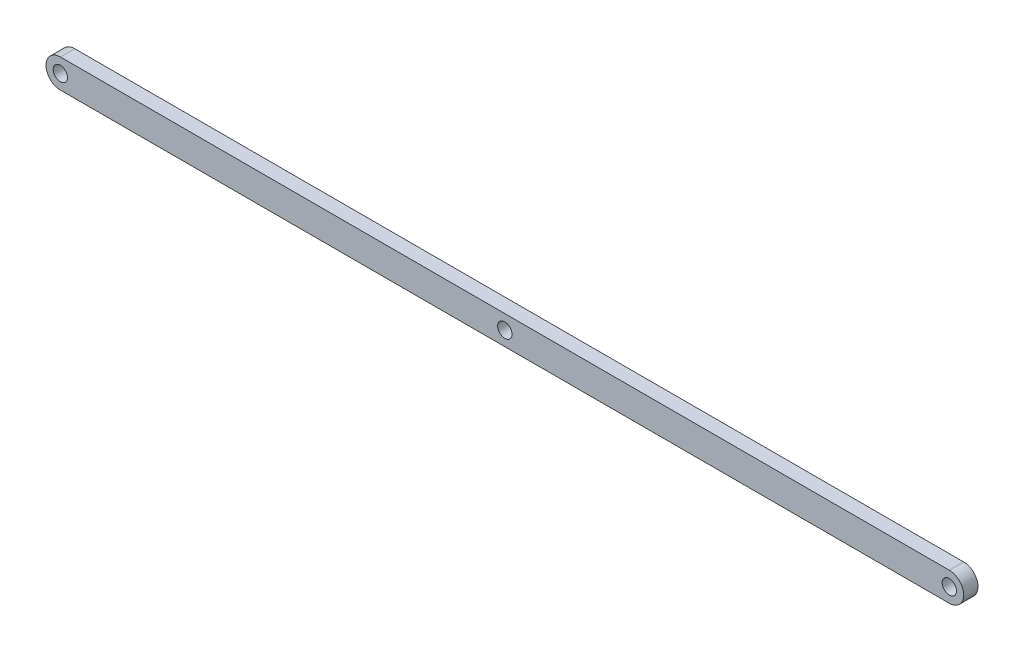
ISO-10303-21;
HEADER;
FILE_DESCRIPTION(('STEP AP214'),'2;1');
FILE_NAME('part.step','',(''),(''),'','','');
FILE_SCHEMA(('AUTOMOTIVE_DESIGN { 1 0 10303 214 1 1 1 1 }'));
ENDSEC;
DATA;
#1=APPLICATION_CONTEXT('core data for automotive mechanical design processes');
#2=APPLICATION_PROTOCOL_DEFINITION('international standard','automotive_design',2000,#1);
#3=PRODUCT_CONTEXT('',#1,'mechanical');
#4=PRODUCT('Part','Part','',(#3));
#5=PRODUCT_RELATED_PRODUCT_CATEGORY('part','',(#4));
#6=PRODUCT_DEFINITION_FORMATION('','',#4);
#7=PRODUCT_DEFINITION_CONTEXT('part definition',#1,'design');
#8=PRODUCT_DEFINITION('design','',#6,#7);
#9=PRODUCT_DEFINITION_SHAPE('','',#8);
#10=(LENGTH_UNIT() NAMED_UNIT(*) SI_UNIT(.MILLI.,.METRE.));
#11=(NAMED_UNIT(*) PLANE_ANGLE_UNIT() SI_UNIT($,.RADIAN.));
#12=(NAMED_UNIT(*) SI_UNIT($,.STERADIAN.) SOLID_ANGLE_UNIT());
#13=UNCERTAINTY_MEASURE_WITH_UNIT(LENGTH_MEASURE(1.E-05),#10,'distance_accuracy_value','');
#14=(GEOMETRIC_REPRESENTATION_CONTEXT(3) GLOBAL_UNCERTAINTY_ASSIGNED_CONTEXT((#13)) GLOBAL_UNIT_ASSIGNED_CONTEXT((#10,
#11,#12)) REPRESENTATION_CONTEXT('',''));
#15=CARTESIAN_POINT('',(0.,0.,0.));
#16=DIRECTION('',(0.,0.,1.));
#17=DIRECTION('',(1.,0.,0.));
#18=AXIS2_PLACEMENT_3D('',#15,#16,#17);
#19=CARTESIAN_POINT('',(310.,1.44510668817275E-13,10.));
#20=DIRECTION('',(0.,0.,1.));
#21=DIRECTION('',(1.,0.,0.));
#22=AXIS2_PLACEMENT_3D('',#19,#20,#21);
#23=PLANE('',#22);
#24=CARTESIAN_POINT('',(310.,1.44510668817275E-13,10.));
#25=DIRECTION('',(0.,0.,1.));
#26=DIRECTION('',(1.,0.,0.));
#27=AXIS2_PLACEMENT_3D('',#24,#25,#26);
#28=CIRCLE('',#27,4.99999999999999);
#29=CARTESIAN_POINT('',(315.,1.44510668817275E-13,10.));
#30=VERTEX_POINT('',#29);
#31=EDGE_CURVE('E115',#30,#30,#28,.T.);
#32=ORIENTED_EDGE('',*,*,#31,.F.);
#33=EDGE_LOOP('',(#32));
#34=FACE_BOUND('',#33,.T.);
#35=CARTESIAN_POINT('',(310.,1.44510668817275E-13,10.));
#36=DIRECTION('',(0.,0.,1.));
#37=DIRECTION('',(1.,0.,0.));
#38=AXIS2_PLACEMENT_3D('',#35,#36,#37);
#39=CIRCLE('',#38,9.99999999999989);
#40=CARTESIAN_POINT('',(310.,-9.99999999999977,10.));
#41=VERTEX_POINT('',#40);
#42=CARTESIAN_POINT('',(310.,10.,10.));
#43=VERTEX_POINT('',#42);
#44=EDGE_CURVE('E85',#41,#43,#39,.T.);
#45=ORIENTED_EDGE('',*,*,#44,.T.);
#46=DIRECTION('',(-1.,0.,0.));
#47=VECTOR('',#46,1.);
#48=CARTESIAN_POINT('',(310.,10.,10.));
#49=LINE('',#48,#47);
#50=CARTESIAN_POINT('',(-310.,9.99999999999984,10.));
#51=VERTEX_POINT('',#50);
#52=EDGE_CURVE('E80',#43,#51,#49,.T.);
#53=ORIENTED_EDGE('',*,*,#52,.T.);
#54=CARTESIAN_POINT('',(-310.,0.,10.));
#55=DIRECTION('',(0.,0.,1.));
#56=DIRECTION('',(1.,0.,0.));
#57=AXIS2_PLACEMENT_3D('',#54,#55,#56);
#58=CIRCLE('',#57,9.99999999999989);
#59=CARTESIAN_POINT('',(-310.,-9.99999999999996,10.));
#60=VERTEX_POINT('',#59);
#61=EDGE_CURVE('E83',#51,#60,#58,.T.);
#62=ORIENTED_EDGE('',*,*,#61,.T.);
#63=DIRECTION('',(1.,0.,0.));
#64=VECTOR('',#63,1.);
#65=CARTESIAN_POINT('',(310.,-9.99999999999977,10.));
#66=LINE('',#65,#64);
#67=EDGE_CURVE('E50',#60,#41,#66,.T.);
#68=ORIENTED_EDGE('',*,*,#67,.T.);
#69=EDGE_LOOP('',(#45,#53,#62,#68));
#70=FACE_BOUND('',#69,.T.);
#71=CARTESIAN_POINT('',(-310.,0.,10.));
#72=DIRECTION('',(0.,0.,1.));
#73=DIRECTION('',(1.,0.,0.));
#74=AXIS2_PLACEMENT_3D('',#71,#72,#73);
#75=CIRCLE('',#74,4.99999999999999);
#76=CARTESIAN_POINT('',(-305.,0.,10.));
#77=VERTEX_POINT('',#76);
#78=EDGE_CURVE('E100',#77,#77,#75,.T.);
#79=ORIENTED_EDGE('',*,*,#78,.F.);
#80=EDGE_LOOP('',(#79));
#81=FACE_BOUND('',#80,.T.);
#82=CARTESIAN_POINT('',(0.,0.,10.));
#83=DIRECTION('',(0.,0.,1.));
#84=DIRECTION('',(1.,0.,0.));
#85=AXIS2_PLACEMENT_3D('',#82,#83,#84);
#86=CIRCLE('',#85,5.);
#87=CARTESIAN_POINT('',(5.,0.,10.));
#88=VERTEX_POINT('',#87);
#89=EDGE_CURVE('E121',#88,#88,#86,.T.);
#90=ORIENTED_EDGE('',*,*,#89,.F.);
#91=EDGE_LOOP('',(#90));
#92=FACE_BOUND('',#91,.T.);
#93=ADVANCED_FACE('F33',(#34,#70,#81,#92),#23,.T.);
#94=CARTESIAN_POINT('',(310.,1.44510668817275E-13,0.));
#95=DIRECTION('',(0.,0.,1.));
#96=DIRECTION('',(1.,0.,0.));
#97=AXIS2_PLACEMENT_3D('',#94,#95,#96);
#98=PLANE('',#97);
#99=CARTESIAN_POINT('',(310.,1.44510668817275E-13,0.));
#100=DIRECTION('',(0.,0.,1.));
#101=DIRECTION('',(1.,0.,0.));
#102=AXIS2_PLACEMENT_3D('',#99,#100,#101);
#103=CIRCLE('',#102,9.99999999999989);
#104=CARTESIAN_POINT('',(310.,-9.99999999999977,0.));
#105=VERTEX_POINT('',#104);
#106=CARTESIAN_POINT('',(310.,10.,0.));
#107=VERTEX_POINT('',#106);
#108=EDGE_CURVE('E97',#105,#107,#103,.T.);
#109=ORIENTED_EDGE('',*,*,#108,.F.);
#110=DIRECTION('',(1.,0.,0.));
#111=VECTOR('',#110,1.);
#112=CARTESIAN_POINT('',(310.,-9.99999999999977,0.));
#113=LINE('',#112,#111);
#114=CARTESIAN_POINT('',(-310.,-9.99999999999996,0.));
#115=VERTEX_POINT('',#114);
#116=EDGE_CURVE('E73',#115,#105,#113,.T.);
#117=ORIENTED_EDGE('',*,*,#116,.F.);
#118=CARTESIAN_POINT('',(-310.,0.,0.));
#119=DIRECTION('',(0.,0.,1.));
#120=DIRECTION('',(1.,0.,0.));
#121=AXIS2_PLACEMENT_3D('',#118,#119,#120);
#122=CIRCLE('',#121,9.99999999999989);
#123=CARTESIAN_POINT('',(-310.,9.99999999999984,0.));
#124=VERTEX_POINT('',#123);
#125=EDGE_CURVE('E67',#124,#115,#122,.T.);
#126=ORIENTED_EDGE('',*,*,#125,.F.);
#127=DIRECTION('',(-1.,0.,0.));
#128=VECTOR('',#127,1.);
#129=CARTESIAN_POINT('',(310.,10.,0.));
#130=LINE('',#129,#128);
#131=EDGE_CURVE('E89',#107,#124,#130,.T.);
#132=ORIENTED_EDGE('',*,*,#131,.F.);
#133=EDGE_LOOP('',(#109,#117,#126,#132));
#134=FACE_BOUND('',#133,.T.);
#135=CARTESIAN_POINT('',(-310.,0.,0.));
#136=DIRECTION('',(0.,0.,1.));
#137=DIRECTION('',(1.,0.,0.));
#138=AXIS2_PLACEMENT_3D('',#135,#136,#137);
#139=CIRCLE('',#138,4.99999999999999);
#140=CARTESIAN_POINT('',(-305.,0.,0.));
#141=VERTEX_POINT('',#140);
#142=EDGE_CURVE('E112',#141,#141,#139,.T.);
#143=ORIENTED_EDGE('',*,*,#142,.T.);
#144=EDGE_LOOP('',(#143));
#145=FACE_BOUND('',#144,.T.);
#146=CARTESIAN_POINT('',(310.,1.44510668817275E-13,0.));
#147=DIRECTION('',(0.,0.,1.));
#148=DIRECTION('',(1.,0.,0.));
#149=AXIS2_PLACEMENT_3D('',#146,#147,#148);
#150=CIRCLE('',#149,4.99999999999999);
#151=CARTESIAN_POINT('',(315.,1.44510668817275E-13,0.));
#152=VERTEX_POINT('',#151);
#153=EDGE_CURVE('E118',#152,#152,#150,.T.);
#154=ORIENTED_EDGE('',*,*,#153,.T.);
#155=EDGE_LOOP('',(#154));
#156=FACE_BOUND('',#155,.T.);
#157=CARTESIAN_POINT('',(0.,0.,0.));
#158=DIRECTION('',(0.,0.,1.));
#159=DIRECTION('',(1.,0.,0.));
#160=AXIS2_PLACEMENT_3D('',#157,#158,#159);
#161=CIRCLE('',#160,5.);
#162=CARTESIAN_POINT('',(5.,0.,0.));
#163=VERTEX_POINT('',#162);
#164=EDGE_CURVE('E124',#163,#163,#161,.T.);
#165=ORIENTED_EDGE('',*,*,#164,.T.);
#166=EDGE_LOOP('',(#165));
#167=FACE_BOUND('',#166,.T.);
#168=ADVANCED_FACE('F108',(#134,#145,#156,#167),#98,.F.);
#169=CARTESIAN_POINT('',(310.,1.44510668817275E-13,10.));
#170=DIRECTION('',(0.,0.,-1.));
#171=DIRECTION('',(-1.,0.,0.));
#172=AXIS2_PLACEMENT_3D('',#169,#170,#171);
#173=CYLINDRICAL_SURFACE('',#172,9.99999999999989);
#174=ORIENTED_EDGE('',*,*,#108,.T.);
#175=DIRECTION('',(0.,0.,-1.));
#176=VECTOR('',#175,1.);
#177=CARTESIAN_POINT('',(310.,10.,10.));
#178=LINE('',#177,#176);
#179=EDGE_CURVE('E11',#43,#107,#178,.T.);
#180=ORIENTED_EDGE('',*,*,#179,.F.);
#181=ORIENTED_EDGE('',*,*,#44,.F.);
#182=DIRECTION('',(0.,0.,-1.));
#183=VECTOR('',#182,1.);
#184=CARTESIAN_POINT('',(310.,-9.99999999999977,10.));
#185=LINE('',#184,#183);
#186=EDGE_CURVE('E93',#41,#105,#185,.T.);
#187=ORIENTED_EDGE('',*,*,#186,.T.);
#188=EDGE_LOOP('',(#174,#180,#181,#187));
#189=FACE_BOUND('',#188,.T.);
#190=ADVANCED_FACE('F35',(#189),#173,.T.);
#191=CARTESIAN_POINT('',(310.,10.,10.));
#192=DIRECTION('',(0.,-1.,0.));
#193=DIRECTION('',(1.,0.,0.));
#194=AXIS2_PLACEMENT_3D('',#191,#192,#193);
#195=PLANE('',#194);
#196=ORIENTED_EDGE('',*,*,#131,.T.);
#197=DIRECTION('',(0.,0.,-1.));
#198=VECTOR('',#197,1.);
#199=CARTESIAN_POINT('',(-310.,9.99999999999984,10.));
#200=LINE('',#199,#198);
#201=EDGE_CURVE('E42',#51,#124,#200,.T.);
#202=ORIENTED_EDGE('',*,*,#201,.F.);
#203=ORIENTED_EDGE('',*,*,#52,.F.);
#204=ORIENTED_EDGE('',*,*,#179,.T.);
#205=EDGE_LOOP('',(#196,#202,#203,#204));
#206=FACE_BOUND('',#205,.T.);
#207=ADVANCED_FACE('F88',(#206),#195,.F.);
#208=CARTESIAN_POINT('',(-310.,0.,10.));
#209=DIRECTION('',(0.,0.,-1.));
#210=DIRECTION('',(-1.,0.,0.));
#211=AXIS2_PLACEMENT_3D('',#208,#209,#210);
#212=CYLINDRICAL_SURFACE('',#211,9.99999999999989);
#213=ORIENTED_EDGE('',*,*,#125,.T.);
#214=DIRECTION('',(0.,0.,-1.));
#215=VECTOR('',#214,1.);
#216=CARTESIAN_POINT('',(-310.,-9.99999999999996,10.));
#217=LINE('',#216,#215);
#218=EDGE_CURVE('E90',#60,#115,#217,.T.);
#219=ORIENTED_EDGE('',*,*,#218,.F.);
#220=ORIENTED_EDGE('',*,*,#61,.F.);
#221=ORIENTED_EDGE('',*,*,#201,.T.);
#222=EDGE_LOOP('',(#213,#219,#220,#221));
#223=FACE_BOUND('',#222,.T.);
#224=ADVANCED_FACE('F91',(#223),#212,.T.);
#225=CARTESIAN_POINT('',(310.,-9.99999999999977,10.));
#226=DIRECTION('',(0.,1.,0.));
#227=DIRECTION('',(-1.,0.,0.));
#228=AXIS2_PLACEMENT_3D('',#225,#226,#227);
#229=PLANE('',#228);
#230=ORIENTED_EDGE('',*,*,#116,.T.);
#231=ORIENTED_EDGE('',*,*,#186,.F.);
#232=ORIENTED_EDGE('',*,*,#67,.F.);
#233=ORIENTED_EDGE('',*,*,#218,.T.);
#234=EDGE_LOOP('',(#230,#231,#232,#233));
#235=FACE_BOUND('',#234,.T.);
#236=ADVANCED_FACE('F105',(#235),#229,.F.);
#237=CARTESIAN_POINT('',(-310.,0.,10.));
#238=DIRECTION('',(0.,0.,-1.));
#239=DIRECTION('',(-1.,0.,0.));
#240=AXIS2_PLACEMENT_3D('',#237,#238,#239);
#241=CYLINDRICAL_SURFACE('',#240,4.99999999999999);
#242=ORIENTED_EDGE('',*,*,#78,.T.);
#243=EDGE_LOOP('',(#242));
#244=FACE_BOUND('',#243,.T.);
#245=ORIENTED_EDGE('',*,*,#142,.F.);
#246=EDGE_LOOP('',(#245));
#247=FACE_BOUND('',#246,.T.);
#248=ADVANCED_FACE('F142',(#244,#247),#241,.F.);
#249=CARTESIAN_POINT('',(310.,1.44510668817275E-13,10.));
#250=DIRECTION('',(0.,0.,-1.));
#251=DIRECTION('',(-1.,0.,0.));
#252=AXIS2_PLACEMENT_3D('',#249,#250,#251);
#253=CYLINDRICAL_SURFACE('',#252,4.99999999999999);
#254=ORIENTED_EDGE('',*,*,#31,.T.);
#255=EDGE_LOOP('',(#254));
#256=FACE_BOUND('',#255,.T.);
#257=ORIENTED_EDGE('',*,*,#153,.F.);
#258=EDGE_LOOP('',(#257));
#259=FACE_BOUND('',#258,.T.);
#260=ADVANCED_FACE('F188',(#256,#259),#253,.F.);
#261=CARTESIAN_POINT('',(0.,0.,10.));
#262=DIRECTION('',(0.,0.,-1.));
#263=DIRECTION('',(-1.,0.,0.));
#264=AXIS2_PLACEMENT_3D('',#261,#262,#263);
#265=CYLINDRICAL_SURFACE('',#264,5.);
#266=ORIENTED_EDGE('',*,*,#89,.T.);
#267=EDGE_LOOP('',(#266));
#268=FACE_BOUND('',#267,.T.);
#269=ORIENTED_EDGE('',*,*,#164,.F.);
#270=EDGE_LOOP('',(#269));
#271=FACE_BOUND('',#270,.T.);
#272=ADVANCED_FACE('F130',(#268,#271),#265,.F.);
#273=CLOSED_SHELL('',(#93,#168,#190,#207,#224,#236,#248,#260,#272));
#274=MANIFOLD_SOLID_BREP('B2',#273);
#275=ADVANCED_BREP_SHAPE_REPRESENTATION('',(#18,#274),#14);
#276=SHAPE_DEFINITION_REPRESENTATION(#9,#275);
ENDSEC;
END-ISO-10303-21;
